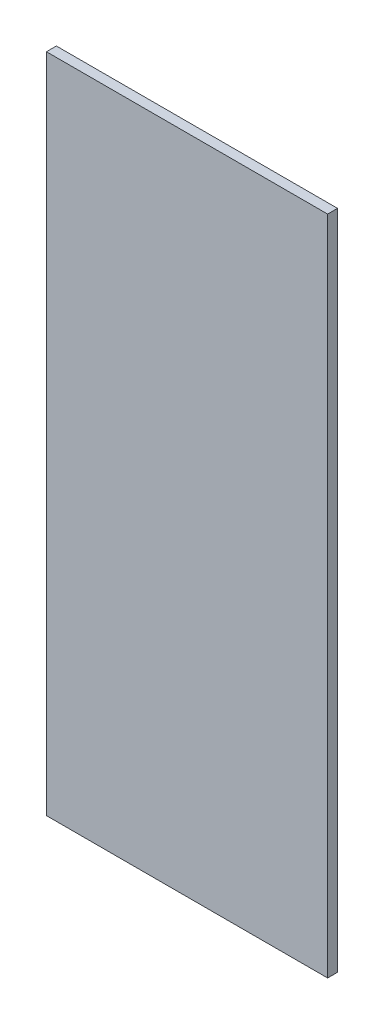
ISO-10303-21;
HEADER;
FILE_DESCRIPTION(('STEP AP214'),'2;1');
FILE_NAME('part.step','',(''),(''),'','','');
FILE_SCHEMA(('AUTOMOTIVE_DESIGN { 1 0 10303 214 1 1 1 1 }'));
ENDSEC;
DATA;
#1=APPLICATION_CONTEXT('core data for automotive mechanical design processes');
#2=APPLICATION_PROTOCOL_DEFINITION('international standard','automotive_design',2000,#1);
#3=PRODUCT_CONTEXT('',#1,'mechanical');
#4=PRODUCT('Part','Part','',(#3));
#5=PRODUCT_RELATED_PRODUCT_CATEGORY('part','',(#4));
#6=PRODUCT_DEFINITION_FORMATION('','',#4);
#7=PRODUCT_DEFINITION_CONTEXT('part definition',#1,'design');
#8=PRODUCT_DEFINITION('design','',#6,#7);
#9=PRODUCT_DEFINITION_SHAPE('','',#8);
#10=(LENGTH_UNIT() NAMED_UNIT(*) SI_UNIT(.MILLI.,.METRE.));
#11=(NAMED_UNIT(*) PLANE_ANGLE_UNIT() SI_UNIT($,.RADIAN.));
#12=(NAMED_UNIT(*) SI_UNIT($,.STERADIAN.) SOLID_ANGLE_UNIT());
#13=UNCERTAINTY_MEASURE_WITH_UNIT(LENGTH_MEASURE(1.E-05),#10,'distance_accuracy_value','');
#14=(GEOMETRIC_REPRESENTATION_CONTEXT(3) GLOBAL_UNCERTAINTY_ASSIGNED_CONTEXT((#13)) GLOBAL_UNIT_ASSIGNED_CONTEXT((#10,
#11,#12)) REPRESENTATION_CONTEXT('',''));
#15=CARTESIAN_POINT('',(0.,0.,0.));
#16=DIRECTION('',(0.,0.,1.));
#17=DIRECTION('',(1.,0.,0.));
#18=AXIS2_PLACEMENT_3D('',#15,#16,#17);
#19=CARTESIAN_POINT('',(-28.5714285714286,377.104761904762,6.));
#20=DIRECTION('',(1.,0.,0.));
#21=DIRECTION('',(0.,1.,0.));
#22=AXIS2_PLACEMENT_3D('',#19,#20,#21);
#23=PLANE('',#22);
#24=DIRECTION('',(0.,-1.,0.));
#25=VECTOR('',#24,1.);
#26=CARTESIAN_POINT('',(-28.5714285714286,377.104761904762,0.));
#27=LINE('',#26,#25);
#28=CARTESIAN_POINT('',(-28.5714285714286,377.104761904762,0.));
#29=VERTEX_POINT('',#28);
#30=CARTESIAN_POINT('',(-28.5714285714286,-22.8952380952381,0.));
#31=VERTEX_POINT('',#30);
#32=EDGE_CURVE('E95',#29,#31,#27,.T.);
#33=ORIENTED_EDGE('',*,*,#32,.T.);
#34=DIRECTION('',(0.,0.,-1.));
#35=VECTOR('',#34,1.);
#36=CARTESIAN_POINT('',(-28.5714285714286,-22.8952380952381,6.));
#37=LINE('',#36,#35);
#38=CARTESIAN_POINT('',(-28.5714285714286,-22.8952380952381,6.));
#39=VERTEX_POINT('',#38);
#40=EDGE_CURVE('E11',#39,#31,#37,.T.);
#41=ORIENTED_EDGE('',*,*,#40,.F.);
#42=DIRECTION('',(0.,-1.,0.));
#43=VECTOR('',#42,1.);
#44=CARTESIAN_POINT('',(-28.5714285714286,377.104761904762,6.));
#45=LINE('',#44,#43);
#46=CARTESIAN_POINT('',(-28.5714285714286,377.104761904762,6.));
#47=VERTEX_POINT('',#46);
#48=EDGE_CURVE('E83',#47,#39,#45,.T.);
#49=ORIENTED_EDGE('',*,*,#48,.F.);
#50=DIRECTION('',(0.,0.,-1.));
#51=VECTOR('',#50,1.);
#52=CARTESIAN_POINT('',(-28.5714285714286,377.104761904762,6.));
#53=LINE('',#52,#51);
#54=EDGE_CURVE('E91',#47,#29,#53,.T.);
#55=ORIENTED_EDGE('',*,*,#54,.T.);
#56=EDGE_LOOP('',(#33,#41,#49,#55));
#57=FACE_BOUND('',#56,.T.);
#58=ADVANCED_FACE('F32',(#57),#23,.F.);
#59=CARTESIAN_POINT('',(-28.5714285714286,-22.8952380952381,6.));
#60=DIRECTION('',(0.,1.,0.));
#61=DIRECTION('',(0.,0.,1.));
#62=AXIS2_PLACEMENT_3D('',#59,#60,#61);
#63=PLANE('',#62);
#64=DIRECTION('',(1.,0.,0.));
#65=VECTOR('',#64,1.);
#66=CARTESIAN_POINT('',(-28.5714285714286,-22.8952380952381,0.));
#67=LINE('',#66,#65);
#68=CARTESIAN_POINT('',(141.428571428571,-22.8952380952381,0.));
#69=VERTEX_POINT('',#68);
#70=EDGE_CURVE('E87',#31,#69,#67,.T.);
#71=ORIENTED_EDGE('',*,*,#70,.T.);
#72=DIRECTION('',(0.,0.,-1.));
#73=VECTOR('',#72,1.);
#74=CARTESIAN_POINT('',(141.428571428571,-22.8952380952381,6.));
#75=LINE('',#74,#73);
#76=CARTESIAN_POINT('',(141.428571428571,-22.8952380952381,6.));
#77=VERTEX_POINT('',#76);
#78=EDGE_CURVE('E40',#77,#69,#75,.T.);
#79=ORIENTED_EDGE('',*,*,#78,.F.);
#80=DIRECTION('',(1.,0.,0.));
#81=VECTOR('',#80,1.);
#82=CARTESIAN_POINT('',(-28.5714285714286,-22.8952380952381,6.));
#83=LINE('',#82,#81);
#84=EDGE_CURVE('E78',#39,#77,#83,.T.);
#85=ORIENTED_EDGE('',*,*,#84,.F.);
#86=ORIENTED_EDGE('',*,*,#40,.T.);
#87=EDGE_LOOP('',(#71,#79,#85,#86));
#88=FACE_BOUND('',#87,.T.);
#89=ADVANCED_FACE('F86',(#88),#63,.F.);
#90=CARTESIAN_POINT('',(141.428571428571,377.104761904762,6.));
#91=DIRECTION('',(-1.,0.,0.));
#92=DIRECTION('',(0.,-1.,0.));
#93=AXIS2_PLACEMENT_3D('',#90,#91,#92);
#94=PLANE('',#93);
#95=DIRECTION('',(0.,1.,0.));
#96=VECTOR('',#95,1.);
#97=CARTESIAN_POINT('',(141.428571428571,377.104761904762,0.));
#98=LINE('',#97,#96);
#99=CARTESIAN_POINT('',(141.428571428571,377.104761904762,0.));
#100=VERTEX_POINT('',#99);
#101=EDGE_CURVE('E65',#69,#100,#98,.T.);
#102=ORIENTED_EDGE('',*,*,#101,.T.);
#103=DIRECTION('',(0.,0.,-1.));
#104=VECTOR('',#103,1.);
#105=CARTESIAN_POINT('',(141.428571428571,377.104761904762,6.));
#106=LINE('',#105,#104);
#107=CARTESIAN_POINT('',(141.428571428571,377.104761904762,6.));
#108=VERTEX_POINT('',#107);
#109=EDGE_CURVE('E88',#108,#100,#106,.T.);
#110=ORIENTED_EDGE('',*,*,#109,.F.);
#111=DIRECTION('',(0.,1.,0.));
#112=VECTOR('',#111,1.);
#113=CARTESIAN_POINT('',(141.428571428571,377.104761904762,6.));
#114=LINE('',#113,#112);
#115=EDGE_CURVE('E81',#77,#108,#114,.T.);
#116=ORIENTED_EDGE('',*,*,#115,.F.);
#117=ORIENTED_EDGE('',*,*,#78,.T.);
#118=EDGE_LOOP('',(#102,#110,#116,#117));
#119=FACE_BOUND('',#118,.T.);
#120=ADVANCED_FACE('F89',(#119),#94,.F.);
#121=CARTESIAN_POINT('',(-28.5714285714286,377.104761904762,6.));
#122=DIRECTION('',(0.,-1.,0.));
#123=DIRECTION('',(0.,0.,-1.));
#124=AXIS2_PLACEMENT_3D('',#121,#122,#123);
#125=PLANE('',#124);
#126=DIRECTION('',(-1.,0.,0.));
#127=VECTOR('',#126,1.);
#128=CARTESIAN_POINT('',(-28.5714285714286,377.104761904762,0.));
#129=LINE('',#128,#127);
#130=EDGE_CURVE('E71',#100,#29,#129,.T.);
#131=ORIENTED_EDGE('',*,*,#130,.T.);
#132=ORIENTED_EDGE('',*,*,#54,.F.);
#133=DIRECTION('',(-1.,0.,0.));
#134=VECTOR('',#133,1.);
#135=CARTESIAN_POINT('',(-28.5714285714286,377.104761904762,6.));
#136=LINE('',#135,#134);
#137=EDGE_CURVE('E48',#108,#47,#136,.T.);
#138=ORIENTED_EDGE('',*,*,#137,.F.);
#139=ORIENTED_EDGE('',*,*,#109,.T.);
#140=EDGE_LOOP('',(#131,#132,#138,#139));
#141=FACE_BOUND('',#140,.T.);
#142=ADVANCED_FACE('F102',(#141),#125,.F.);
#143=CARTESIAN_POINT('',(0.,0.,6.));
#144=DIRECTION('',(0.,0.,1.));
#145=DIRECTION('',(1.,0.,0.));
#146=AXIS2_PLACEMENT_3D('',#143,#144,#145);
#147=PLANE('',#146);
#148=ORIENTED_EDGE('',*,*,#48,.T.);
#149=ORIENTED_EDGE('',*,*,#84,.T.);
#150=ORIENTED_EDGE('',*,*,#115,.T.);
#151=ORIENTED_EDGE('',*,*,#137,.T.);
#152=EDGE_LOOP('',(#148,#149,#150,#151));
#153=FACE_BOUND('',#152,.T.);
#154=ADVANCED_FACE('F79',(#153),#147,.T.);
#155=CARTESIAN_POINT('',(0.,0.,0.));
#156=DIRECTION('',(0.,0.,1.));
#157=DIRECTION('',(1.,0.,0.));
#158=AXIS2_PLACEMENT_3D('',#155,#156,#157);
#159=PLANE('',#158);
#160=ORIENTED_EDGE('',*,*,#32,.F.);
#161=ORIENTED_EDGE('',*,*,#130,.F.);
#162=ORIENTED_EDGE('',*,*,#101,.F.);
#163=ORIENTED_EDGE('',*,*,#70,.F.);
#164=EDGE_LOOP('',(#160,#161,#162,#163));
#165=FACE_BOUND('',#164,.T.);
#166=ADVANCED_FACE('F105',(#165),#159,.F.);
#167=CLOSED_SHELL('',(#58,#89,#120,#142,#154,#166));
#168=MANIFOLD_SOLID_BREP('B2',#167);
#169=ADVANCED_BREP_SHAPE_REPRESENTATION('',(#18,#168),#14);
#170=SHAPE_DEFINITION_REPRESENTATION(#9,#169);
ENDSEC;
END-ISO-10303-21;
